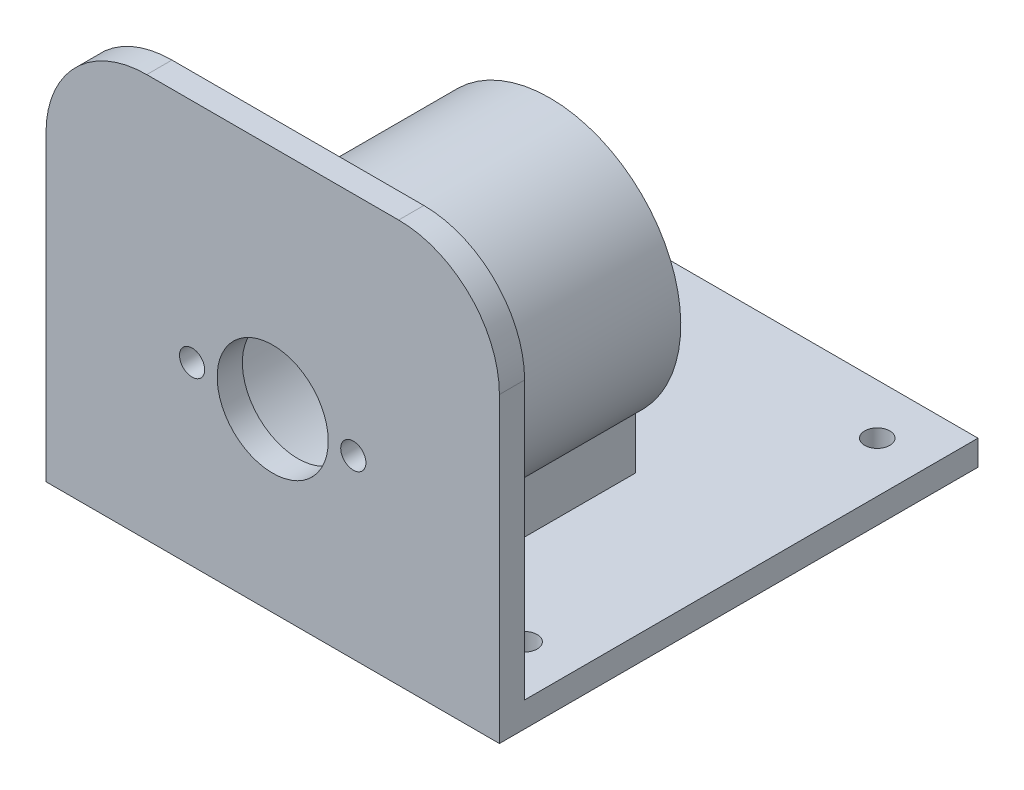
ISO-10303-21;
HEADER;
FILE_DESCRIPTION(('STEP AP214'),'2;1');
FILE_NAME('part.step','',(''),(''),'','','');
FILE_SCHEMA(('AUTOMOTIVE_DESIGN { 1 0 10303 214 1 1 1 1 }'));
ENDSEC;
DATA;
#1=APPLICATION_CONTEXT('core data for automotive mechanical design processes');
#2=APPLICATION_PROTOCOL_DEFINITION('international standard','automotive_design',2000,#1);
#3=PRODUCT_CONTEXT('',#1,'mechanical');
#4=PRODUCT('Part','Part','',(#3));
#5=PRODUCT_RELATED_PRODUCT_CATEGORY('part','',(#4));
#6=PRODUCT_DEFINITION_FORMATION('','',#4);
#7=PRODUCT_DEFINITION_CONTEXT('part definition',#1,'design');
#8=PRODUCT_DEFINITION('design','',#6,#7);
#9=PRODUCT_DEFINITION_SHAPE('','',#8);
#10=(LENGTH_UNIT() NAMED_UNIT(*) SI_UNIT(.MILLI.,.METRE.));
#11=(NAMED_UNIT(*) PLANE_ANGLE_UNIT() SI_UNIT($,.RADIAN.));
#12=(NAMED_UNIT(*) SI_UNIT($,.STERADIAN.) SOLID_ANGLE_UNIT());
#13=UNCERTAINTY_MEASURE_WITH_UNIT(LENGTH_MEASURE(1.E-05),#10,'distance_accuracy_value','');
#14=(GEOMETRIC_REPRESENTATION_CONTEXT(3) GLOBAL_UNCERTAINTY_ASSIGNED_CONTEXT((#13)) GLOBAL_UNIT_ASSIGNED_CONTEXT((#10,
#11,#12)) REPRESENTATION_CONTEXT('',''));
#15=CARTESIAN_POINT('',(0.,0.,0.));
#16=DIRECTION('',(0.,0.,1.));
#17=DIRECTION('',(1.,0.,0.));
#18=AXIS2_PLACEMENT_3D('',#15,#16,#17);
#19=CARTESIAN_POINT('',(-25.,25.,-5.));
#20=DIRECTION('',(0.,0.,1.));
#21=DIRECTION('',(1.,0.,0.));
#22=AXIS2_PLACEMENT_3D('',#19,#20,#21);
#23=PLANE('',#22);
#24=CARTESIAN_POINT('',(-16.,0.,-5.));
#25=DIRECTION('',(0.,0.,1.));
#26=DIRECTION('',(1.,0.,0.));
#27=AXIS2_PLACEMENT_3D('',#24,#25,#26);
#28=CIRCLE('',#27,2.5);
#29=CARTESIAN_POINT('',(-13.5,0.,-5.));
#30=VERTEX_POINT('',#29);
#31=EDGE_CURVE('E381',#30,#30,#28,.T.);
#32=ORIENTED_EDGE('',*,*,#31,.T.);
#33=EDGE_LOOP('',(#32));
#34=FACE_BOUND('',#33,.T.);
#35=CARTESIAN_POINT('',(16.,0.,-5.));
#36=DIRECTION('',(0.,0.,1.));
#37=DIRECTION('',(1.,0.,0.));
#38=AXIS2_PLACEMENT_3D('',#35,#36,#37);
#39=CIRCLE('',#38,2.5);
#40=CARTESIAN_POINT('',(18.5,0.,-5.));
#41=VERTEX_POINT('',#40);
#42=EDGE_CURVE('E371',#41,#41,#39,.T.);
#43=ORIENTED_EDGE('',*,*,#42,.T.);
#44=EDGE_LOOP('',(#43));
#45=FACE_BOUND('',#44,.T.);
#46=CARTESIAN_POINT('',(0.,0.,-5.));
#47=DIRECTION('',(0.,0.,1.));
#48=DIRECTION('',(1.,0.,0.));
#49=AXIS2_PLACEMENT_3D('',#46,#47,#48);
#50=CIRCLE('',#49,11.025);
#51=CARTESIAN_POINT('',(11.025,0.,-5.));
#52=VERTEX_POINT('',#51);
#53=EDGE_CURVE('E203',#52,#52,#50,.T.);
#54=ORIENTED_EDGE('',*,*,#53,.T.);
#55=EDGE_LOOP('',(#54));
#56=FACE_BOUND('',#55,.T.);
#57=CARTESIAN_POINT('',(0.,0.,-5.));
#58=DIRECTION('',(0.,0.,-1.));
#59=DIRECTION('',(-1.,0.,0.));
#60=AXIS2_PLACEMENT_3D('',#57,#58,#59);
#61=CIRCLE('',#60,21.5);
#62=CARTESIAN_POINT('',(-21.5,0.,-5.));
#63=VERTEX_POINT('',#62);
#64=EDGE_CURVE('E384',#63,#63,#61,.T.);
#65=ORIENTED_EDGE('',*,*,#64,.T.);
#66=EDGE_LOOP('',(#65));
#67=FACE_BOUND('',#66,.T.);
#68=ADVANCED_FACE('F39',(#34,#45,#56,#67),#23,.F.);
#69=CARTESIAN_POINT('',(45.,-30.,-95.));
#70=DIRECTION('',(0.,-1.,0.));
#71=DIRECTION('',(1.,0.,0.));
#72=AXIS2_PLACEMENT_3D('',#69,#70,#71);
#73=PLANE('',#72);
#74=CARTESIAN_POINT('',(-35.,-30.,-15.));
#75=DIRECTION('',(0.,1.,0.));
#76=DIRECTION('',(1.,0.,0.));
#77=AXIS2_PLACEMENT_3D('',#74,#75,#76);
#78=CIRCLE('',#77,2.5);
#79=CARTESIAN_POINT('',(-32.5,-30.,-15.));
#80=VERTEX_POINT('',#79);
#81=EDGE_CURVE('E450',#80,#80,#78,.T.);
#82=ORIENTED_EDGE('',*,*,#81,.F.);
#83=EDGE_LOOP('',(#82));
#84=FACE_BOUND('',#83,.T.);
#85=CARTESIAN_POINT('',(35.,-30.,-15.));
#86=DIRECTION('',(0.,1.,0.));
#87=DIRECTION('',(-1.,0.,0.));
#88=AXIS2_PLACEMENT_3D('',#85,#86,#87);
#89=CIRCLE('',#88,2.5);
#90=CARTESIAN_POINT('',(32.5,-30.,-15.));
#91=VERTEX_POINT('',#90);
#92=EDGE_CURVE('E440',#91,#91,#89,.T.);
#93=ORIENTED_EDGE('',*,*,#92,.F.);
#94=EDGE_LOOP('',(#93));
#95=FACE_BOUND('',#94,.T.);
#96=CARTESIAN_POINT('',(35.,-30.,-85.));
#97=DIRECTION('',(0.,1.,0.));
#98=DIRECTION('',(1.,0.,0.));
#99=AXIS2_PLACEMENT_3D('',#96,#97,#98);
#100=CIRCLE('',#99,2.5);
#101=CARTESIAN_POINT('',(37.5,-30.,-85.));
#102=VERTEX_POINT('',#101);
#103=EDGE_CURVE('E431',#102,#102,#100,.T.);
#104=ORIENTED_EDGE('',*,*,#103,.F.);
#105=EDGE_LOOP('',(#104));
#106=FACE_BOUND('',#105,.T.);
#107=CARTESIAN_POINT('',(-35.,-30.,-85.));
#108=DIRECTION('',(0.,1.,0.));
#109=DIRECTION('',(-1.,0.,0.));
#110=AXIS2_PLACEMENT_3D('',#107,#108,#109);
#111=CIRCLE('',#110,2.5);
#112=CARTESIAN_POINT('',(-37.5,-30.,-85.));
#113=VERTEX_POINT('',#112);
#114=EDGE_CURVE('E374',#113,#113,#111,.T.);
#115=ORIENTED_EDGE('',*,*,#114,.F.);
#116=EDGE_LOOP('',(#115));
#117=FACE_BOUND('',#116,.T.);
#118=DIRECTION('',(0.,0.,1.));
#119=VECTOR('',#118,1.);
#120=CARTESIAN_POINT('',(-17.,-30.,-55.));
#121=LINE('',#120,#119);
#122=CARTESIAN_POINT('',(-17.,-30.,-55.));
#123=VERTEX_POINT('',#122);
#124=CARTESIAN_POINT('',(-17.,-30.,-5.));
#125=VERTEX_POINT('',#124);
#126=EDGE_CURVE('E148',#123,#125,#121,.T.);
#127=ORIENTED_EDGE('',*,*,#126,.F.);
#128=DIRECTION('',(-1.,0.,0.));
#129=VECTOR('',#128,1.);
#130=CARTESIAN_POINT('',(17.,-30.,-55.));
#131=LINE('',#130,#129);
#132=CARTESIAN_POINT('',(17.,-30.,-55.));
#133=VERTEX_POINT('',#132);
#134=EDGE_CURVE('E137',#133,#123,#131,.T.);
#135=ORIENTED_EDGE('',*,*,#134,.F.);
#136=DIRECTION('',(0.,0.,1.));
#137=VECTOR('',#136,1.);
#138=CARTESIAN_POINT('',(17.,-30.,-55.));
#139=LINE('',#138,#137);
#140=CARTESIAN_POINT('',(17.,-30.,-5.));
#141=VERTEX_POINT('',#140);
#142=EDGE_CURVE('E158',#133,#141,#139,.T.);
#143=ORIENTED_EDGE('',*,*,#142,.T.);
#144=DIRECTION('',(1.,0.,0.));
#145=VECTOR('',#144,1.);
#146=CARTESIAN_POINT('',(45.,-30.,-5.));
#147=LINE('',#146,#145);
#148=CARTESIAN_POINT('',(45.,-30.,-5.));
#149=VERTEX_POINT('',#148);
#150=EDGE_CURVE('E175',#141,#149,#147,.T.);
#151=ORIENTED_EDGE('',*,*,#150,.T.);
#152=DIRECTION('',(0.,0.,1.));
#153=VECTOR('',#152,1.);
#154=CARTESIAN_POINT('',(45.,-30.,-95.));
#155=LINE('',#154,#153);
#156=CARTESIAN_POINT('',(45.,-30.,-95.));
#157=VERTEX_POINT('',#156);
#158=EDGE_CURVE('E191',#157,#149,#155,.T.);
#159=ORIENTED_EDGE('',*,*,#158,.F.);
#160=DIRECTION('',(1.,0.,0.));
#161=VECTOR('',#160,1.);
#162=CARTESIAN_POINT('',(45.,-30.,-95.));
#163=LINE('',#162,#161);
#164=CARTESIAN_POINT('',(-45.,-30.,-95.));
#165=VERTEX_POINT('',#164);
#166=EDGE_CURVE('E188',#165,#157,#163,.T.);
#167=ORIENTED_EDGE('',*,*,#166,.F.);
#168=DIRECTION('',(0.,0.,1.));
#169=VECTOR('',#168,1.);
#170=CARTESIAN_POINT('',(-45.,-30.,-95.));
#171=LINE('',#170,#169);
#172=CARTESIAN_POINT('',(-45.,-30.,-5.));
#173=VERTEX_POINT('',#172);
#174=EDGE_CURVE('E198',#165,#173,#171,.T.);
#175=ORIENTED_EDGE('',*,*,#174,.T.);
#176=EDGE_CURVE('E181',#173,#125,#147,.T.);
#177=ORIENTED_EDGE('',*,*,#176,.T.);
#178=EDGE_LOOP('',(#127,#135,#143,#151,#159,#167,#175,#177));
#179=FACE_BOUND('',#178,.T.);
#180=ADVANCED_FACE('F287',(#84,#95,#106,#117,#179),#73,.F.);
#181=DIRECTION('',(0.,1.,0.));
#182=VECTOR('',#181,1.);
#183=CARTESIAN_POINT('',(-17.,-30.,-5.));
#184=LINE('',#183,#182);
#185=CARTESIAN_POINT('',(-17.,-19.672315572906,-5.));
#186=VERTEX_POINT('',#185);
#187=EDGE_CURVE('E145',#125,#186,#184,.T.);
#188=ORIENTED_EDGE('',*,*,#187,.F.);
#189=ORIENTED_EDGE('',*,*,#176,.F.);
#190=DIRECTION('',(0.,-1.,0.));
#191=VECTOR('',#190,1.);
#192=CARTESIAN_POINT('',(-45.,-35.,-5.));
#193=LINE('',#192,#191);
#194=CARTESIAN_POINT('',(-45.,24.9999999999998,-5.));
#195=VERTEX_POINT('',#194);
#196=EDGE_CURVE('E227',#195,#173,#193,.T.);
#197=ORIENTED_EDGE('',*,*,#196,.F.);
#198=CARTESIAN_POINT('',(-25.,25.,-5.));
#199=DIRECTION('',(0.,0.,1.));
#200=DIRECTION('',(1.,0.,0.));
#201=AXIS2_PLACEMENT_3D('',#198,#199,#200);
#202=CIRCLE('',#201,20.);
#203=CARTESIAN_POINT('',(-24.9999999999999,45.,-5.));
#204=VERTEX_POINT('',#203);
#205=EDGE_CURVE('E223',#204,#195,#202,.T.);
#206=ORIENTED_EDGE('',*,*,#205,.F.);
#207=DIRECTION('',(-1.,0.,0.));
#208=VECTOR('',#207,1.);
#209=CARTESIAN_POINT('',(-24.9999999999999,45.,-5.));
#210=LINE('',#209,#208);
#211=CARTESIAN_POINT('',(24.9999999999999,45.,-5.));
#212=VERTEX_POINT('',#211);
#213=EDGE_CURVE('E219',#212,#204,#210,.T.);
#214=ORIENTED_EDGE('',*,*,#213,.F.);
#215=CARTESIAN_POINT('',(25.,25.,-5.));
#216=DIRECTION('',(0.,0.,1.));
#217=DIRECTION('',(1.,0.,0.));
#218=AXIS2_PLACEMENT_3D('',#215,#216,#217);
#219=CIRCLE('',#218,20.);
#220=CARTESIAN_POINT('',(45.,24.9999999999999,-5.));
#221=VERTEX_POINT('',#220);
#222=EDGE_CURVE('E214',#221,#212,#219,.T.);
#223=ORIENTED_EDGE('',*,*,#222,.F.);
#224=DIRECTION('',(0.,1.,0.));
#225=VECTOR('',#224,1.);
#226=CARTESIAN_POINT('',(45.,24.9999999999999,-5.));
#227=LINE('',#226,#225);
#228=EDGE_CURVE('E211',#149,#221,#227,.T.);
#229=ORIENTED_EDGE('',*,*,#228,.F.);
#230=ORIENTED_EDGE('',*,*,#150,.F.);
#231=DIRECTION('',(0.,-1.,0.));
#232=VECTOR('',#231,1.);
#233=CARTESIAN_POINT('',(17.,-30.,-5.));
#234=LINE('',#233,#232);
#235=CARTESIAN_POINT('',(17.,-19.672315572906,-5.));
#236=VERTEX_POINT('',#235);
#237=EDGE_CURVE('E62',#236,#141,#234,.T.);
#238=ORIENTED_EDGE('',*,*,#237,.F.);
#239=CARTESIAN_POINT('',(0.,0.,-5.));
#240=DIRECTION('',(0.,0.,-1.));
#241=DIRECTION('',(-1.,0.,0.));
#242=AXIS2_PLACEMENT_3D('',#239,#240,#241);
#243=CIRCLE('',#242,26.);
#244=EDGE_CURVE('E57',#186,#236,#243,.T.);
#245=ORIENTED_EDGE('',*,*,#244,.F.);
#246=EDGE_LOOP('',(#188,#189,#197,#206,#214,#223,#229,#230,#238,#245));
#247=FACE_BOUND('',#246,.T.);
#248=ADVANCED_FACE('F290',(#247),#23,.F.);
#249=CARTESIAN_POINT('',(45.,-2.30530655858519,-5.));
#250=DIRECTION('',(1.,0.,0.));
#251=DIRECTION('',(0.,1.,0.));
#252=AXIS2_PLACEMENT_3D('',#249,#250,#251);
#253=PLANE('',#252);
#254=DIRECTION('',(0.,1.,0.));
#255=VECTOR('',#254,1.);
#256=CARTESIAN_POINT('',(45.,-2.30530655858519,0.));
#257=LINE('',#256,#255);
#258=CARTESIAN_POINT('',(45.,-35.,0.));
#259=VERTEX_POINT('',#258);
#260=CARTESIAN_POINT('',(45.,24.9999999999999,0.));
#261=VERTEX_POINT('',#260);
#262=EDGE_CURVE('E215',#259,#261,#257,.T.);
#263=ORIENTED_EDGE('',*,*,#262,.F.);
#264=DIRECTION('',(0.,0.,1.));
#265=VECTOR('',#264,1.);
#266=CARTESIAN_POINT('',(45.,-35.,-5.));
#267=LINE('',#266,#265);
#268=CARTESIAN_POINT('',(45.,-35.,-95.));
#269=VERTEX_POINT('',#268);
#270=EDGE_CURVE('E11',#269,#259,#267,.T.);
#271=ORIENTED_EDGE('',*,*,#270,.F.);
#272=DIRECTION('',(0.,-1.,0.));
#273=VECTOR('',#272,1.);
#274=CARTESIAN_POINT('',(45.,-35.,-95.));
#275=LINE('',#274,#273);
#276=EDGE_CURVE('E176',#157,#269,#275,.T.);
#277=ORIENTED_EDGE('',*,*,#276,.F.);
#278=ORIENTED_EDGE('',*,*,#158,.T.);
#279=ORIENTED_EDGE('',*,*,#228,.T.);
#280=DIRECTION('',(0.,0.,1.));
#281=VECTOR('',#280,1.);
#282=CARTESIAN_POINT('',(45.,24.9999999999999,-5.));
#283=LINE('',#282,#281);
#284=EDGE_CURVE('E43',#221,#261,#283,.T.);
#285=ORIENTED_EDGE('',*,*,#284,.T.);
#286=EDGE_LOOP('',(#263,#271,#277,#278,#279,#285));
#287=FACE_BOUND('',#286,.T.);
#288=ADVANCED_FACE('F269',(#287),#253,.T.);
#289=CARTESIAN_POINT('',(45.,-35.,-5.));
#290=DIRECTION('',(0.,-1.,0.));
#291=DIRECTION('',(1.,0.,0.));
#292=AXIS2_PLACEMENT_3D('',#289,#290,#291);
#293=PLANE('',#292);
#294=CARTESIAN_POINT('',(-35.,-35.,-15.));
#295=DIRECTION('',(0.,1.,0.));
#296=DIRECTION('',(1.,0.,0.));
#297=AXIS2_PLACEMENT_3D('',#294,#295,#296);
#298=CIRCLE('',#297,2.5);
#299=CARTESIAN_POINT('',(-32.5,-35.,-15.));
#300=VERTEX_POINT('',#299);
#301=EDGE_CURVE('E446',#300,#300,#298,.T.);
#302=ORIENTED_EDGE('',*,*,#301,.T.);
#303=EDGE_LOOP('',(#302));
#304=FACE_BOUND('',#303,.T.);
#305=CARTESIAN_POINT('',(35.,-35.,-15.));
#306=DIRECTION('',(0.,1.,0.));
#307=DIRECTION('',(-1.,0.,0.));
#308=AXIS2_PLACEMENT_3D('',#305,#306,#307);
#309=CIRCLE('',#308,2.5);
#310=CARTESIAN_POINT('',(32.5,-35.,-15.));
#311=VERTEX_POINT('',#310);
#312=EDGE_CURVE('E434',#311,#311,#309,.T.);
#313=ORIENTED_EDGE('',*,*,#312,.T.);
#314=EDGE_LOOP('',(#313));
#315=FACE_BOUND('',#314,.T.);
#316=CARTESIAN_POINT('',(35.,-35.,-85.));
#317=DIRECTION('',(0.,1.,0.));
#318=DIRECTION('',(1.,0.,0.));
#319=AXIS2_PLACEMENT_3D('',#316,#317,#318);
#320=CIRCLE('',#319,2.5);
#321=CARTESIAN_POINT('',(37.5,-35.,-85.));
#322=VERTEX_POINT('',#321);
#323=EDGE_CURVE('E428',#322,#322,#320,.T.);
#324=ORIENTED_EDGE('',*,*,#323,.T.);
#325=EDGE_LOOP('',(#324));
#326=FACE_BOUND('',#325,.T.);
#327=CARTESIAN_POINT('',(-35.,-35.,-85.));
#328=DIRECTION('',(0.,1.,0.));
#329=DIRECTION('',(-1.,0.,0.));
#330=AXIS2_PLACEMENT_3D('',#327,#328,#329);
#331=CIRCLE('',#330,2.5);
#332=CARTESIAN_POINT('',(-37.5,-35.,-85.));
#333=VERTEX_POINT('',#332);
#334=EDGE_CURVE('E367',#333,#333,#331,.T.);
#335=ORIENTED_EDGE('',*,*,#334,.T.);
#336=EDGE_LOOP('',(#335));
#337=FACE_BOUND('',#336,.T.);
#338=DIRECTION('',(1.,0.,0.));
#339=VECTOR('',#338,1.);
#340=CARTESIAN_POINT('',(45.,-35.,0.));
#341=LINE('',#340,#339);
#342=CARTESIAN_POINT('',(-45.,-35.,0.));
#343=VERTEX_POINT('',#342);
#344=EDGE_CURVE('E246',#343,#259,#341,.T.);
#345=ORIENTED_EDGE('',*,*,#344,.F.);
#346=DIRECTION('',(0.,0.,1.));
#347=VECTOR('',#346,1.);
#348=CARTESIAN_POINT('',(-45.,-35.,-5.));
#349=LINE('',#348,#347);
#350=CARTESIAN_POINT('',(-45.,-35.,-95.));
#351=VERTEX_POINT('',#350);
#352=EDGE_CURVE('E49',#351,#343,#349,.T.);
#353=ORIENTED_EDGE('',*,*,#352,.F.);
#354=DIRECTION('',(-1.,0.,0.));
#355=VECTOR('',#354,1.);
#356=CARTESIAN_POINT('',(45.,-35.,-95.));
#357=LINE('',#356,#355);
#358=EDGE_CURVE('E180',#269,#351,#357,.T.);
#359=ORIENTED_EDGE('',*,*,#358,.F.);
#360=ORIENTED_EDGE('',*,*,#270,.T.);
#361=EDGE_LOOP('',(#345,#353,#359,#360));
#362=FACE_BOUND('',#361,.T.);
#363=ADVANCED_FACE('F277',(#304,#315,#326,#337,#362),#293,.T.);
#364=CARTESIAN_POINT('',(-45.,-35.,-5.));
#365=DIRECTION('',(-1.,0.,0.));
#366=DIRECTION('',(0.,-1.,0.));
#367=AXIS2_PLACEMENT_3D('',#364,#365,#366);
#368=PLANE('',#367);
#369=DIRECTION('',(0.,-1.,0.));
#370=VECTOR('',#369,1.);
#371=CARTESIAN_POINT('',(-45.,-35.,0.));
#372=LINE('',#371,#370);
#373=CARTESIAN_POINT('',(-45.,24.9999999999998,0.));
#374=VERTEX_POINT('',#373);
#375=EDGE_CURVE('E242',#374,#343,#372,.T.);
#376=ORIENTED_EDGE('',*,*,#375,.F.);
#377=DIRECTION('',(0.,0.,1.));
#378=VECTOR('',#377,1.);
#379=CARTESIAN_POINT('',(-45.,24.9999999999998,-5.));
#380=LINE('',#379,#378);
#381=EDGE_CURVE('E254',#195,#374,#380,.T.);
#382=ORIENTED_EDGE('',*,*,#381,.F.);
#383=ORIENTED_EDGE('',*,*,#196,.T.);
#384=ORIENTED_EDGE('',*,*,#174,.F.);
#385=DIRECTION('',(0.,1.,0.));
#386=VECTOR('',#385,1.);
#387=CARTESIAN_POINT('',(-45.,-35.,-95.));
#388=LINE('',#387,#386);
#389=EDGE_CURVE('E185',#351,#165,#388,.T.);
#390=ORIENTED_EDGE('',*,*,#389,.F.);
#391=ORIENTED_EDGE('',*,*,#352,.T.);
#392=EDGE_LOOP('',(#376,#382,#383,#384,#390,#391));
#393=FACE_BOUND('',#392,.T.);
#394=ADVANCED_FACE('F300',(#393),#368,.T.);
#395=CARTESIAN_POINT('',(-25.,25.,-5.));
#396=DIRECTION('',(0.,0.,1.));
#397=DIRECTION('',(1.,0.,0.));
#398=AXIS2_PLACEMENT_3D('',#395,#396,#397);
#399=CYLINDRICAL_SURFACE('',#398,20.);
#400=CARTESIAN_POINT('',(-25.,25.,0.));
#401=DIRECTION('',(0.,0.,1.));
#402=DIRECTION('',(1.,0.,0.));
#403=AXIS2_PLACEMENT_3D('',#400,#401,#402);
#404=CIRCLE('',#403,20.);
#405=CARTESIAN_POINT('',(-24.9999999999999,45.,0.));
#406=VERTEX_POINT('',#405);
#407=EDGE_CURVE('E238',#406,#374,#404,.T.);
#408=ORIENTED_EDGE('',*,*,#407,.F.);
#409=DIRECTION('',(0.,0.,1.));
#410=VECTOR('',#409,1.);
#411=CARTESIAN_POINT('',(-24.9999999999999,45.,-5.));
#412=LINE('',#411,#410);
#413=EDGE_CURVE('E257',#204,#406,#412,.T.);
#414=ORIENTED_EDGE('',*,*,#413,.F.);
#415=ORIENTED_EDGE('',*,*,#205,.T.);
#416=ORIENTED_EDGE('',*,*,#381,.T.);
#417=EDGE_LOOP('',(#408,#414,#415,#416));
#418=FACE_BOUND('',#417,.T.);
#419=ADVANCED_FACE('F298',(#418),#399,.T.);
#420=CARTESIAN_POINT('',(-24.9999999999999,45.,-5.));
#421=DIRECTION('',(0.,1.,0.));
#422=DIRECTION('',(-1.,0.,0.));
#423=AXIS2_PLACEMENT_3D('',#420,#421,#422);
#424=PLANE('',#423);
#425=DIRECTION('',(-1.,0.,0.));
#426=VECTOR('',#425,1.);
#427=CARTESIAN_POINT('',(-24.9999999999999,45.,0.));
#428=LINE('',#427,#426);
#429=CARTESIAN_POINT('',(24.9999999999999,45.,0.));
#430=VERTEX_POINT('',#429);
#431=EDGE_CURVE('E234',#430,#406,#428,.T.);
#432=ORIENTED_EDGE('',*,*,#431,.F.);
#433=DIRECTION('',(0.,0.,1.));
#434=VECTOR('',#433,1.);
#435=CARTESIAN_POINT('',(24.9999999999999,45.,-5.));
#436=LINE('',#435,#434);
#437=EDGE_CURVE('E259',#212,#430,#436,.T.);
#438=ORIENTED_EDGE('',*,*,#437,.F.);
#439=ORIENTED_EDGE('',*,*,#213,.T.);
#440=ORIENTED_EDGE('',*,*,#413,.T.);
#441=EDGE_LOOP('',(#432,#438,#439,#440));
#442=FACE_BOUND('',#441,.T.);
#443=ADVANCED_FACE('F295',(#442),#424,.T.);
#444=CARTESIAN_POINT('',(25.,25.,-5.));
#445=DIRECTION('',(0.,0.,1.));
#446=DIRECTION('',(1.,0.,0.));
#447=AXIS2_PLACEMENT_3D('',#444,#445,#446);
#448=CYLINDRICAL_SURFACE('',#447,20.);
#449=CARTESIAN_POINT('',(25.,25.,0.));
#450=DIRECTION('',(0.,0.,1.));
#451=DIRECTION('',(1.,0.,0.));
#452=AXIS2_PLACEMENT_3D('',#449,#450,#451);
#453=CIRCLE('',#452,20.);
#454=EDGE_CURVE('E207',#261,#430,#453,.T.);
#455=ORIENTED_EDGE('',*,*,#454,.F.);
#456=ORIENTED_EDGE('',*,*,#284,.F.);
#457=ORIENTED_EDGE('',*,*,#222,.T.);
#458=ORIENTED_EDGE('',*,*,#437,.T.);
#459=EDGE_LOOP('',(#455,#456,#457,#458));
#460=FACE_BOUND('',#459,.T.);
#461=ADVANCED_FACE('F41',(#460),#448,.T.);
#462=CARTESIAN_POINT('',(-25.,25.,0.));
#463=DIRECTION('',(0.,0.,1.));
#464=DIRECTION('',(1.,0.,0.));
#465=AXIS2_PLACEMENT_3D('',#462,#463,#464);
#466=PLANE('',#465);
#467=CARTESIAN_POINT('',(-16.,0.,0.));
#468=DIRECTION('',(0.,0.,1.));
#469=DIRECTION('',(1.,0.,0.));
#470=AXIS2_PLACEMENT_3D('',#467,#468,#469);
#471=CIRCLE('',#470,2.5);
#472=CARTESIAN_POINT('',(-13.5,0.,0.));
#473=VERTEX_POINT('',#472);
#474=EDGE_CURVE('E358',#473,#473,#471,.T.);
#475=ORIENTED_EDGE('',*,*,#474,.F.);
#476=EDGE_LOOP('',(#475));
#477=FACE_BOUND('',#476,.T.);
#478=CARTESIAN_POINT('',(16.,0.,0.));
#479=DIRECTION('',(0.,0.,1.));
#480=DIRECTION('',(-1.,0.,0.));
#481=AXIS2_PLACEMENT_3D('',#478,#479,#480);
#482=CIRCLE('',#481,2.5);
#483=CARTESIAN_POINT('',(13.5,0.,0.));
#484=VERTEX_POINT('',#483);
#485=EDGE_CURVE('E362',#484,#484,#482,.T.);
#486=ORIENTED_EDGE('',*,*,#485,.F.);
#487=EDGE_LOOP('',(#486));
#488=FACE_BOUND('',#487,.T.);
#489=CARTESIAN_POINT('',(0.,0.,0.));
#490=DIRECTION('',(0.,0.,1.));
#491=DIRECTION('',(1.,0.,0.));
#492=AXIS2_PLACEMENT_3D('',#489,#490,#491);
#493=CIRCLE('',#492,11.025);
#494=CARTESIAN_POINT('',(11.025,0.,0.));
#495=VERTEX_POINT('',#494);
#496=EDGE_CURVE('E202',#495,#495,#493,.T.);
#497=ORIENTED_EDGE('',*,*,#496,.F.);
#498=EDGE_LOOP('',(#497));
#499=FACE_BOUND('',#498,.T.);
#500=ORIENTED_EDGE('',*,*,#262,.T.);
#501=ORIENTED_EDGE('',*,*,#454,.T.);
#502=ORIENTED_EDGE('',*,*,#431,.T.);
#503=ORIENTED_EDGE('',*,*,#407,.T.);
#504=ORIENTED_EDGE('',*,*,#375,.T.);
#505=ORIENTED_EDGE('',*,*,#344,.T.);
#506=EDGE_LOOP('',(#500,#501,#502,#503,#504,#505));
#507=FACE_BOUND('',#506,.T.);
#508=ADVANCED_FACE('F273',(#477,#488,#499,#507),#466,.T.);
#509=CARTESIAN_POINT('',(0.,0.,-5.));
#510=DIRECTION('',(0.,0.,1.));
#511=DIRECTION('',(1.,0.,0.));
#512=AXIS2_PLACEMENT_3D('',#509,#510,#511);
#513=CYLINDRICAL_SURFACE('',#512,11.025);
#514=ORIENTED_EDGE('',*,*,#53,.F.);
#515=EDGE_LOOP('',(#514));
#516=FACE_BOUND('',#515,.T.);
#517=ORIENTED_EDGE('',*,*,#496,.T.);
#518=EDGE_LOOP('',(#517));
#519=FACE_BOUND('',#518,.T.);
#520=ADVANCED_FACE('F349',(#516,#519),#513,.F.);
#521=CARTESIAN_POINT('',(0.,0.,-95.));
#522=DIRECTION('',(0.,0.,1.));
#523=DIRECTION('',(1.,0.,0.));
#524=AXIS2_PLACEMENT_3D('',#521,#522,#523);
#525=PLANE('',#524);
#526=ORIENTED_EDGE('',*,*,#276,.T.);
#527=ORIENTED_EDGE('',*,*,#358,.T.);
#528=ORIENTED_EDGE('',*,*,#389,.T.);
#529=ORIENTED_EDGE('',*,*,#166,.T.);
#530=EDGE_LOOP('',(#526,#527,#528,#529));
#531=FACE_BOUND('',#530,.T.);
#532=ADVANCED_FACE('F282',(#531),#525,.F.);
#533=CARTESIAN_POINT('',(0.,0.,-55.));
#534=DIRECTION('',(0.,0.,-1.));
#535=DIRECTION('',(-1.,0.,0.));
#536=AXIS2_PLACEMENT_3D('',#533,#534,#535);
#537=PLANE('',#536);
#538=ORIENTED_EDGE('',*,*,#134,.T.);
#539=DIRECTION('',(0.,1.,0.));
#540=VECTOR('',#539,1.);
#541=CARTESIAN_POINT('',(-17.,-30.,-55.));
#542=LINE('',#541,#540);
#543=CARTESIAN_POINT('',(-17.,-19.672315572906,-55.));
#544=VERTEX_POINT('',#543);
#545=EDGE_CURVE('E129',#123,#544,#542,.T.);
#546=ORIENTED_EDGE('',*,*,#545,.T.);
#547=CARTESIAN_POINT('',(0.,0.,-55.));
#548=DIRECTION('',(0.,0.,-1.));
#549=DIRECTION('',(-1.,0.,0.));
#550=AXIS2_PLACEMENT_3D('',#547,#548,#549);
#551=CIRCLE('',#550,26.);
#552=CARTESIAN_POINT('',(17.,-19.672315572906,-55.));
#553=VERTEX_POINT('',#552);
#554=EDGE_CURVE('E135',#544,#553,#551,.T.);
#555=ORIENTED_EDGE('',*,*,#554,.T.);
#556=DIRECTION('',(0.,-1.,0.));
#557=VECTOR('',#556,1.);
#558=CARTESIAN_POINT('',(17.,-30.,-55.));
#559=LINE('',#558,#557);
#560=EDGE_CURVE('E155',#553,#133,#559,.T.);
#561=ORIENTED_EDGE('',*,*,#560,.T.);
#562=EDGE_LOOP('',(#538,#546,#555,#561));
#563=FACE_BOUND('',#562,.T.);
#564=CARTESIAN_POINT('',(0.,0.,-55.));
#565=DIRECTION('',(0.,0.,-1.));
#566=DIRECTION('',(-1.,0.,0.));
#567=AXIS2_PLACEMENT_3D('',#564,#565,#566);
#568=CIRCLE('',#567,21.5);
#569=CARTESIAN_POINT('',(-21.5,0.,-55.));
#570=VERTEX_POINT('',#569);
#571=EDGE_CURVE('E164',#570,#570,#568,.T.);
#572=ORIENTED_EDGE('',*,*,#571,.F.);
#573=EDGE_LOOP('',(#572));
#574=FACE_BOUND('',#573,.T.);
#575=ADVANCED_FACE('F131',(#563,#574),#537,.T.);
#576=CARTESIAN_POINT('',(-17.,-30.,-55.));
#577=DIRECTION('',(1.,0.,0.));
#578=DIRECTION('',(0.,0.,-1.));
#579=AXIS2_PLACEMENT_3D('',#576,#577,#578);
#580=PLANE('',#579);
#581=ORIENTED_EDGE('',*,*,#187,.T.);
#582=DIRECTION('',(0.,0.,1.));
#583=VECTOR('',#582,1.);
#584=CARTESIAN_POINT('',(-17.,-19.672315572906,-55.));
#585=LINE('',#584,#583);
#586=EDGE_CURVE('E143',#544,#186,#585,.T.);
#587=ORIENTED_EDGE('',*,*,#586,.F.);
#588=ORIENTED_EDGE('',*,*,#545,.F.);
#589=ORIENTED_EDGE('',*,*,#126,.T.);
#590=EDGE_LOOP('',(#581,#587,#588,#589));
#591=FACE_BOUND('',#590,.T.);
#592=ADVANCED_FACE('F144',(#591),#580,.F.);
#593=CARTESIAN_POINT('',(0.,0.,-55.));
#594=DIRECTION('',(0.,0.,1.));
#595=DIRECTION('',(1.,0.,0.));
#596=AXIS2_PLACEMENT_3D('',#593,#594,#595);
#597=CYLINDRICAL_SURFACE('',#596,26.);
#598=ORIENTED_EDGE('',*,*,#244,.T.);
#599=DIRECTION('',(0.,0.,1.));
#600=VECTOR('',#599,1.);
#601=CARTESIAN_POINT('',(17.,-19.672315572906,-55.));
#602=LINE('',#601,#600);
#603=EDGE_CURVE('E149',#553,#236,#602,.T.);
#604=ORIENTED_EDGE('',*,*,#603,.F.);
#605=ORIENTED_EDGE('',*,*,#554,.F.);
#606=ORIENTED_EDGE('',*,*,#586,.T.);
#607=EDGE_LOOP('',(#598,#604,#605,#606));
#608=FACE_BOUND('',#607,.T.);
#609=ADVANCED_FACE('F151',(#608),#597,.T.);
#610=CARTESIAN_POINT('',(17.,-30.,-55.));
#611=DIRECTION('',(-1.,0.,0.));
#612=DIRECTION('',(0.,0.,1.));
#613=AXIS2_PLACEMENT_3D('',#610,#611,#612);
#614=PLANE('',#613);
#615=ORIENTED_EDGE('',*,*,#237,.T.);
#616=ORIENTED_EDGE('',*,*,#142,.F.);
#617=ORIENTED_EDGE('',*,*,#560,.F.);
#618=ORIENTED_EDGE('',*,*,#603,.T.);
#619=EDGE_LOOP('',(#615,#616,#617,#618));
#620=FACE_BOUND('',#619,.T.);
#621=ADVANCED_FACE('F303',(#620),#614,.F.);
#622=CARTESIAN_POINT('',(0.,0.,-55.));
#623=DIRECTION('',(0.,0.,1.));
#624=DIRECTION('',(1.,0.,0.));
#625=AXIS2_PLACEMENT_3D('',#622,#623,#624);
#626=CYLINDRICAL_SURFACE('',#625,21.5);
#627=ORIENTED_EDGE('',*,*,#571,.T.);
#628=EDGE_LOOP('',(#627));
#629=FACE_BOUND('',#628,.T.);
#630=ORIENTED_EDGE('',*,*,#64,.F.);
#631=EDGE_LOOP('',(#630));
#632=FACE_BOUND('',#631,.T.);
#633=ADVANCED_FACE('F305',(#629,#632),#626,.F.);
#634=CARTESIAN_POINT('',(16.,0.,-70.));
#635=DIRECTION('',(0.,0.,1.));
#636=DIRECTION('',(1.,0.,0.));
#637=AXIS2_PLACEMENT_3D('',#634,#635,#636);
#638=CYLINDRICAL_SURFACE('',#637,2.5);
#639=ORIENTED_EDGE('',*,*,#485,.T.);
#640=EDGE_LOOP('',(#639));
#641=FACE_BOUND('',#640,.T.);
#642=ORIENTED_EDGE('',*,*,#42,.F.);
#643=EDGE_LOOP('',(#642));
#644=FACE_BOUND('',#643,.T.);
#645=ADVANCED_FACE('F311',(#641,#644),#638,.F.);
#646=CARTESIAN_POINT('',(-16.,0.,-70.));
#647=DIRECTION('',(0.,0.,1.));
#648=DIRECTION('',(1.,0.,0.));
#649=AXIS2_PLACEMENT_3D('',#646,#647,#648);
#650=CYLINDRICAL_SURFACE('',#649,2.5);
#651=ORIENTED_EDGE('',*,*,#474,.T.);
#652=EDGE_LOOP('',(#651));
#653=FACE_BOUND('',#652,.T.);
#654=ORIENTED_EDGE('',*,*,#31,.F.);
#655=EDGE_LOOP('',(#654));
#656=FACE_BOUND('',#655,.T.);
#657=ADVANCED_FACE('F404',(#653,#656),#650,.F.);
#658=CARTESIAN_POINT('',(-35.,-35.,-85.));
#659=DIRECTION('',(0.,1.,0.));
#660=DIRECTION('',(-1.,0.,0.));
#661=AXIS2_PLACEMENT_3D('',#658,#659,#660);
#662=CYLINDRICAL_SURFACE('',#661,2.5);
#663=ORIENTED_EDGE('',*,*,#334,.F.);
#664=EDGE_LOOP('',(#663));
#665=FACE_BOUND('',#664,.T.);
#666=ORIENTED_EDGE('',*,*,#114,.T.);
#667=EDGE_LOOP('',(#666));
#668=FACE_BOUND('',#667,.T.);
#669=ADVANCED_FACE('F407',(#665,#668),#662,.F.);
#670=CARTESIAN_POINT('',(35.,-35.,-85.));
#671=DIRECTION('',(0.,1.,0.));
#672=DIRECTION('',(-1.,0.,0.));
#673=AXIS2_PLACEMENT_3D('',#670,#671,#672);
#674=CYLINDRICAL_SURFACE('',#673,2.5);
#675=ORIENTED_EDGE('',*,*,#323,.F.);
#676=EDGE_LOOP('',(#675));
#677=FACE_BOUND('',#676,.T.);
#678=ORIENTED_EDGE('',*,*,#103,.T.);
#679=EDGE_LOOP('',(#678));
#680=FACE_BOUND('',#679,.T.);
#681=ADVANCED_FACE('F411',(#677,#680),#674,.F.);
#682=CARTESIAN_POINT('',(35.,-35.,-15.));
#683=DIRECTION('',(0.,1.,0.));
#684=DIRECTION('',(-1.,0.,0.));
#685=AXIS2_PLACEMENT_3D('',#682,#683,#684);
#686=CYLINDRICAL_SURFACE('',#685,2.5);
#687=ORIENTED_EDGE('',*,*,#312,.F.);
#688=EDGE_LOOP('',(#687));
#689=FACE_BOUND('',#688,.T.);
#690=ORIENTED_EDGE('',*,*,#92,.T.);
#691=EDGE_LOOP('',(#690));
#692=FACE_BOUND('',#691,.T.);
#693=ADVANCED_FACE('F416',(#689,#692),#686,.F.);
#694=CARTESIAN_POINT('',(-35.,-35.,-15.));
#695=DIRECTION('',(0.,1.,0.));
#696=DIRECTION('',(-1.,0.,0.));
#697=AXIS2_PLACEMENT_3D('',#694,#695,#696);
#698=CYLINDRICAL_SURFACE('',#697,2.5);
#699=ORIENTED_EDGE('',*,*,#301,.F.);
#700=EDGE_LOOP('',(#699));
#701=FACE_BOUND('',#700,.T.);
#702=ORIENTED_EDGE('',*,*,#81,.T.);
#703=EDGE_LOOP('',(#702));
#704=FACE_BOUND('',#703,.T.);
#705=ADVANCED_FACE('F413',(#701,#704),#698,.F.);
#706=CLOSED_SHELL('',(#68,#180,#248,#288,#363,#394,#419,#443,#461,#508,#520,#532,#575,#592,#609,
#621,#633,#645,#657,#669,#681,#693,#705));
#707=MANIFOLD_SOLID_BREP('B2',#706);
#708=ADVANCED_BREP_SHAPE_REPRESENTATION('',(#18,#707),#14);
#709=SHAPE_DEFINITION_REPRESENTATION(#9,#708);
ENDSEC;
END-ISO-10303-21;
